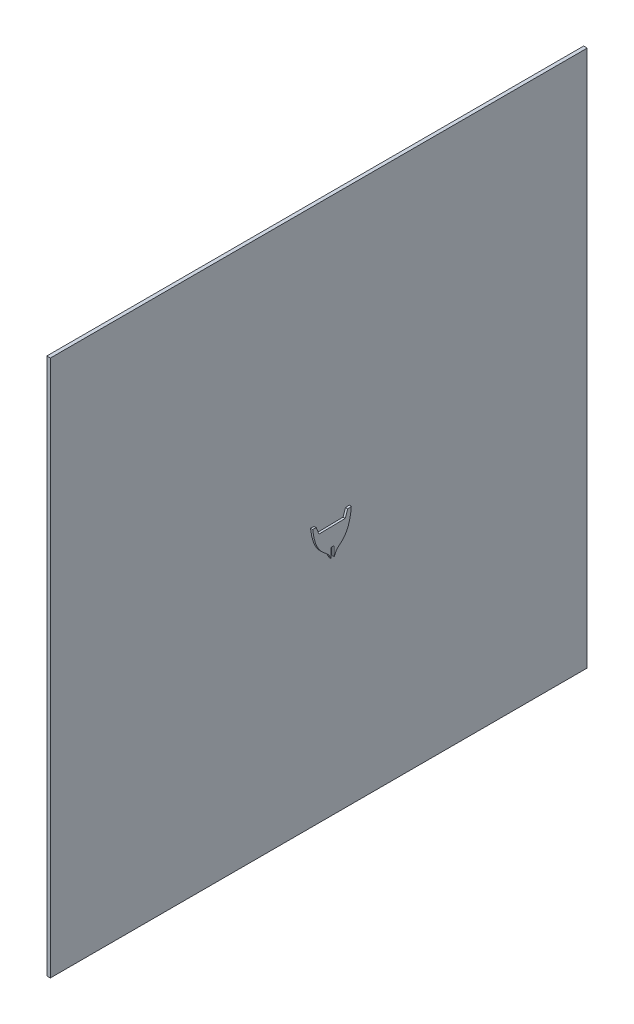
ISO-10303-21;
HEADER;
FILE_DESCRIPTION(('STEP AP214'),'2;1');
FILE_NAME('part.step','',(''),(''),'','','');
FILE_SCHEMA(('AUTOMOTIVE_DESIGN { 1 0 10303 214 1 1 1 1 }'));
ENDSEC;
DATA;
#1=APPLICATION_CONTEXT('core data for automotive mechanical design processes');
#2=APPLICATION_PROTOCOL_DEFINITION('international standard','automotive_design',2000,#1);
#3=PRODUCT_CONTEXT('',#1,'mechanical');
#4=PRODUCT('Part','Part','',(#3));
#5=PRODUCT_RELATED_PRODUCT_CATEGORY('part','',(#4));
#6=PRODUCT_DEFINITION_FORMATION('','',#4);
#7=PRODUCT_DEFINITION_CONTEXT('part definition',#1,'design');
#8=PRODUCT_DEFINITION('design','',#6,#7);
#9=PRODUCT_DEFINITION_SHAPE('','',#8);
#10=(LENGTH_UNIT() NAMED_UNIT(*) SI_UNIT(.MILLI.,.METRE.));
#11=(NAMED_UNIT(*) PLANE_ANGLE_UNIT() SI_UNIT($,.RADIAN.));
#12=(NAMED_UNIT(*) SI_UNIT($,.STERADIAN.) SOLID_ANGLE_UNIT());
#13=UNCERTAINTY_MEASURE_WITH_UNIT(LENGTH_MEASURE(1.E-05),#10,'distance_accuracy_value','');
#14=(GEOMETRIC_REPRESENTATION_CONTEXT(3) GLOBAL_UNCERTAINTY_ASSIGNED_CONTEXT((#13)) GLOBAL_UNIT_ASSIGNED_CONTEXT((#10,
#11,#12)) REPRESENTATION_CONTEXT('',''));
#15=CARTESIAN_POINT('',(0.,0.,0.));
#16=DIRECTION('',(0.,0.,1.));
#17=DIRECTION('',(1.,0.,0.));
#18=AXIS2_PLACEMENT_3D('',#15,#16,#17);
#19=CARTESIAN_POINT('',(6.,356.105695529386,60.4792665259948));
#20=CARTESIAN_POINT('',(6.,286.61749502081,52.7706352403442));
#21=CARTESIAN_POINT('',(6.,278.791819942509,24.4972285058388));
#22=CARTESIAN_POINT('',(6.,286.61749502081,15.6617889013058));
#23=CARTESIAN_POINT('',(6.,245.146035866798,4.44091292248795));
#24=B_SPLINE_CURVE_WITH_KNOTS('',4,(#19,#20,#21,#22,#23),.UNSPECIFIED.,.F.,.F.,(5,5),(0.,1.),.UNSPECIFIED.);
#25=DIRECTION('',(-1.,0.,0.));
#26=VECTOR('',#25,1.);
#27=SURFACE_OF_LINEAR_EXTRUSION('',#24,#26);
#28=CARTESIAN_POINT('',(0.,356.105695529386,60.4792665259948));
#29=CARTESIAN_POINT('',(0.,286.61749502081,52.7706352403442));
#30=CARTESIAN_POINT('',(0.,278.791819942509,24.4972285058388));
#31=CARTESIAN_POINT('',(0.,286.61749502081,15.6617889013058));
#32=CARTESIAN_POINT('',(0.,245.146035866798,4.44091292248795));
#33=B_SPLINE_CURVE_WITH_KNOTS('',4,(#28,#29,#30,#31,#32),.UNSPECIFIED.,.F.,.F.,(5,5),(0.,1.),.UNSPECIFIED.);
#34=CARTESIAN_POINT('',(0.,356.105695529386,60.4792665259948));
#35=VERTEX_POINT('',#34);
#36=CARTESIAN_POINT('',(0.,259.903423688903,9.20972532121438));
#37=VERTEX_POINT('',#36);
#38=EDGE_CURVE('E144',#35,#37,#33,.T.);
#39=ORIENTED_EDGE('',*,*,#38,.T.);
#40=DIRECTION('',(1.,0.,0.));
#41=VECTOR('',#40,1.);
#42=CARTESIAN_POINT('',(0.,259.903423688903,9.20972532121438));
#43=LINE('',#42,#41);
#44=CARTESIAN_POINT('',(6.,259.903423688903,9.20972532121438));
#45=VERTEX_POINT('',#44);
#46=EDGE_CURVE('E150',#37,#45,#43,.T.);
#47=ORIENTED_EDGE('',*,*,#46,.T.);
#48=CARTESIAN_POINT('',(6.,356.105695529386,60.4792665259948));
#49=VERTEX_POINT('',#48);
#50=EDGE_CURVE('E168',#49,#45,#24,.T.);
#51=ORIENTED_EDGE('',*,*,#50,.F.);
#52=DIRECTION('',(-1.,0.,0.));
#53=VECTOR('',#52,1.);
#54=CARTESIAN_POINT('',(6.,356.105695529386,60.4792665259948));
#55=LINE('',#54,#53);
#56=EDGE_CURVE('E140',#49,#35,#55,.T.);
#57=ORIENTED_EDGE('',*,*,#56,.T.);
#58=EDGE_LOOP('',(#39,#47,#51,#57));
#59=FACE_BOUND('',#58,.T.);
#60=ADVANCED_FACE('F46',(#59),#27,.F.);
#61=CARTESIAN_POINT('',(6.,245.146035866798,4.44091292248795));
#62=CARTESIAN_POINT('',(6.,286.996692264015,-5.27055149936918));
#63=CARTESIAN_POINT('',(6.,279.496161382421,-14.3836311067655));
#64=CARTESIAN_POINT('',(6.,288.340732696359,-42.3550500389287));
#65=CARTESIAN_POINT('',(6.,358.062538617364,-47.5418395403267));
#66=B_SPLINE_CURVE_WITH_KNOTS('',4,(#61,#62,#63,#64,#65),.UNSPECIFIED.,.F.,.F.,(5,5),(0.,1.),.UNSPECIFIED.);
#67=DIRECTION('',(-1.,0.,0.));
#68=VECTOR('',#67,1.);
#69=SURFACE_OF_LINEAR_EXTRUSION('',#66,#68);
#70=CARTESIAN_POINT('',(6.,260.066462084205,0.209725321214382));
#71=VERTEX_POINT('',#70);
#72=CARTESIAN_POINT('',(6.,358.062538617364,-47.5418395403267));
#73=VERTEX_POINT('',#72);
#74=EDGE_CURVE('E105',#71,#73,#66,.T.);
#75=ORIENTED_EDGE('',*,*,#74,.F.);
#76=DIRECTION('',(1.,0.,0.));
#77=VECTOR('',#76,1.);
#78=CARTESIAN_POINT('',(0.,260.066462084205,0.209725321214382));
#79=LINE('',#78,#77);
#80=CARTESIAN_POINT('',(0.,260.066462084205,0.209725321214382));
#81=VERTEX_POINT('',#80);
#82=EDGE_CURVE('E196',#81,#71,#79,.T.);
#83=ORIENTED_EDGE('',*,*,#82,.F.);
#84=CARTESIAN_POINT('',(0.,245.146035866798,4.44091292248795));
#85=CARTESIAN_POINT('',(0.,286.996692264015,-5.27055149936918));
#86=CARTESIAN_POINT('',(0.,279.496161382421,-14.3836311067655));
#87=CARTESIAN_POINT('',(0.,288.340732696359,-42.3550500389287));
#88=CARTESIAN_POINT('',(0.,358.062538617364,-47.5418395403267));
#89=B_SPLINE_CURVE_WITH_KNOTS('',4,(#84,#85,#86,#87,#88),.UNSPECIFIED.,.F.,.F.,(5,5),(0.,1.),.UNSPECIFIED.);
#90=CARTESIAN_POINT('',(0.,358.062538617364,-47.5418395403267));
#91=VERTEX_POINT('',#90);
#92=EDGE_CURVE('E149',#81,#91,#89,.T.);
#93=ORIENTED_EDGE('',*,*,#92,.T.);
#94=DIRECTION('',(-1.,0.,0.));
#95=VECTOR('',#94,1.);
#96=CARTESIAN_POINT('',(6.,358.062538617364,-47.5418395403267));
#97=LINE('',#96,#95);
#98=EDGE_CURVE('E13',#73,#91,#97,.T.);
#99=ORIENTED_EDGE('',*,*,#98,.F.);
#100=EDGE_LOOP('',(#75,#83,#93,#99));
#101=FACE_BOUND('',#100,.T.);
#102=ADVANCED_FACE('F208',(#101),#69,.F.);
#103=CARTESIAN_POINT('',(6.,358.062538617364,-47.5418395403267));
#104=DIRECTION('',(0.,-0.994938698469687,-0.100483761312194));
#105=DIRECTION('',(0.,0.100483761312194,-0.994938698469687));
#106=AXIS2_PLACEMENT_3D('',#103,#104,#105);
#107=PLANE('',#106);
#108=DIRECTION('',(0.,-0.100483761312194,0.994938698469687));
#109=VECTOR('',#108,1.);
#110=CARTESIAN_POINT('',(0.,358.062538617364,-47.5418395403267));
#111=LINE('',#110,#109);
#112=CARTESIAN_POINT('',(0.,357.038033491365,-37.3977149243068));
#113=VERTEX_POINT('',#112);
#114=EDGE_CURVE('E157',#91,#113,#111,.T.);
#115=ORIENTED_EDGE('',*,*,#114,.T.);
#116=DIRECTION('',(-1.,0.,0.));
#117=VECTOR('',#116,1.);
#118=CARTESIAN_POINT('',(6.,357.038033491365,-37.3977149243068));
#119=LINE('',#118,#117);
#120=CARTESIAN_POINT('',(6.,357.038033491365,-37.3977149243068));
#121=VERTEX_POINT('',#120);
#122=EDGE_CURVE('E54',#121,#113,#119,.T.);
#123=ORIENTED_EDGE('',*,*,#122,.F.);
#124=DIRECTION('',(0.,-0.100483761312194,0.994938698469687));
#125=VECTOR('',#124,1.);
#126=CARTESIAN_POINT('',(6.,358.062538617364,-47.5418395403267));
#127=LINE('',#126,#125);
#128=EDGE_CURVE('E190',#73,#121,#127,.T.);
#129=ORIENTED_EDGE('',*,*,#128,.F.);
#130=ORIENTED_EDGE('',*,*,#98,.T.);
#131=EDGE_LOOP('',(#115,#123,#129,#130));
#132=FACE_BOUND('',#131,.T.);
#133=ADVANCED_FACE('F211',(#132),#107,.F.);
#134=CARTESIAN_POINT('',(6.,357.038033491365,-37.3977149243068));
#135=DIRECTION('',(0.,-0.329497931100059,-0.944156297124995));
#136=DIRECTION('',(0.,0.944156297124995,-0.329497931100059));
#137=AXIS2_PLACEMENT_3D('',#134,#135,#136);
#138=PLANE('',#137);
#139=DIRECTION('',(0.,-0.944156297124995,0.329497931100058));
#140=VECTOR('',#139,1.);
#141=CARTESIAN_POINT('',(0.,357.038033491365,-37.3977149243068));
#142=LINE('',#141,#140);
#143=CARTESIAN_POINT('',(0.,337.397786243656,-30.5435310840679));
#144=VERTEX_POINT('',#143);
#145=EDGE_CURVE('E162',#113,#144,#142,.T.);
#146=ORIENTED_EDGE('',*,*,#145,.T.);
#147=DIRECTION('',(-1.,0.,0.));
#148=VECTOR('',#147,1.);
#149=CARTESIAN_POINT('',(6.,337.397786243656,-30.5435310840679));
#150=LINE('',#149,#148);
#151=CARTESIAN_POINT('',(6.,337.397786243656,-30.5435310840679));
#152=VERTEX_POINT('',#151);
#153=EDGE_CURVE('E135',#152,#144,#150,.T.);
#154=ORIENTED_EDGE('',*,*,#153,.F.);
#155=DIRECTION('',(0.,-0.944156297124995,0.329497931100058));
#156=VECTOR('',#155,1.);
#157=CARTESIAN_POINT('',(6.,357.038033491365,-37.3977149243068));
#158=LINE('',#157,#156);
#159=EDGE_CURVE('E123',#121,#152,#158,.T.);
#160=ORIENTED_EDGE('',*,*,#159,.F.);
#161=ORIENTED_EDGE('',*,*,#122,.T.);
#162=EDGE_LOOP('',(#146,#154,#160,#161));
#163=FACE_BOUND('',#162,.T.);
#164=ADVANCED_FACE('F175',(#163),#138,.F.);
#165=CARTESIAN_POINT('',(6.,336.070161183109,42.7436570213848));
#166=DIRECTION('',(0.,-0.999835956927465,-0.0181124055536429));
#167=DIRECTION('',(0.,0.0181124055536429,-0.999835956927466));
#168=AXIS2_PLACEMENT_3D('',#165,#166,#167);
#169=PLANE('',#168);
#170=DIRECTION('',(0.,-0.0181124055536429,0.999835956927465));
#171=VECTOR('',#170,1.);
#172=CARTESIAN_POINT('',(0.,336.070161183109,42.7436570213848));
#173=LINE('',#172,#171);
#174=CARTESIAN_POINT('',(0.,336.070161183109,42.7436570213848));
#175=VERTEX_POINT('',#174);
#176=EDGE_CURVE('E132',#144,#175,#173,.T.);
#177=ORIENTED_EDGE('',*,*,#176,.T.);
#178=DIRECTION('',(-1.,0.,0.));
#179=VECTOR('',#178,1.);
#180=CARTESIAN_POINT('',(6.,336.070161183109,42.7436570213848));
#181=LINE('',#180,#179);
#182=CARTESIAN_POINT('',(6.,336.070161183109,42.7436570213848));
#183=VERTEX_POINT('',#182);
#184=EDGE_CURVE('E129',#183,#175,#181,.T.);
#185=ORIENTED_EDGE('',*,*,#184,.F.);
#186=DIRECTION('',(0.,-0.0181124055536429,0.999835956927465));
#187=VECTOR('',#186,1.);
#188=CARTESIAN_POINT('',(6.,336.070161183109,42.7436570213848));
#189=LINE('',#188,#187);
#190=EDGE_CURVE('E116',#152,#183,#189,.T.);
#191=ORIENTED_EDGE('',*,*,#190,.F.);
#192=ORIENTED_EDGE('',*,*,#153,.T.);
#193=EDGE_LOOP('',(#177,#185,#191,#192));
#194=FACE_BOUND('',#193,.T.);
#195=ADVANCED_FACE('F130',(#194),#169,.F.);
#196=CARTESIAN_POINT('',(6.,355.449271317442,50.3046912408778));
#197=DIRECTION('',(0.,-0.363478014358725,0.931602776443822));
#198=DIRECTION('',(0.,-0.931602776443822,-0.363478014358725));
#199=AXIS2_PLACEMENT_3D('',#196,#197,#198);
#200=PLANE('',#199);
#201=DIRECTION('',(0.,0.931602776443822,0.363478014358725));
#202=VECTOR('',#201,1.);
#203=CARTESIAN_POINT('',(0.,355.449271317442,50.3046912408778));
#204=LINE('',#203,#202);
#205=CARTESIAN_POINT('',(0.,355.449271317442,50.3046912408778));
#206=VERTEX_POINT('',#205);
#207=EDGE_CURVE('E165',#175,#206,#204,.T.);
#208=ORIENTED_EDGE('',*,*,#207,.T.);
#209=DIRECTION('',(-1.,0.,0.));
#210=VECTOR('',#209,1.);
#211=CARTESIAN_POINT('',(6.,355.449271317442,50.3046912408778));
#212=LINE('',#211,#210);
#213=CARTESIAN_POINT('',(6.,355.449271317442,50.3046912408778));
#214=VERTEX_POINT('',#213);
#215=EDGE_CURVE('E136',#214,#206,#212,.T.);
#216=ORIENTED_EDGE('',*,*,#215,.F.);
#217=DIRECTION('',(0.,0.931602776443822,0.363478014358725));
#218=VECTOR('',#217,1.);
#219=CARTESIAN_POINT('',(6.,355.449271317442,50.3046912408778));
#220=LINE('',#219,#218);
#221=EDGE_CURVE('E120',#183,#214,#220,.T.);
#222=ORIENTED_EDGE('',*,*,#221,.F.);
#223=ORIENTED_EDGE('',*,*,#184,.T.);
#224=EDGE_LOOP('',(#208,#216,#222,#223));
#225=FACE_BOUND('',#224,.T.);
#226=ADVANCED_FACE('F138',(#225),#200,.F.);
#227=CARTESIAN_POINT('',(6.,356.105695529386,60.4792665259948));
#228=DIRECTION('',(0.,-0.997925308968458,0.064382277997968));
#229=DIRECTION('',(0.,-0.064382277997968,-0.997925308968458));
#230=AXIS2_PLACEMENT_3D('',#227,#228,#229);
#231=PLANE('',#230);
#232=DIRECTION('',(0.,0.064382277997968,0.997925308968458));
#233=VECTOR('',#232,1.);
#234=CARTESIAN_POINT('',(0.,356.105695529386,60.4792665259948));
#235=LINE('',#234,#233);
#236=EDGE_CURVE('E97',#206,#35,#235,.T.);
#237=ORIENTED_EDGE('',*,*,#236,.T.);
#238=ORIENTED_EDGE('',*,*,#56,.F.);
#239=DIRECTION('',(0.,0.064382277997968,0.997925308968458));
#240=VECTOR('',#239,1.);
#241=CARTESIAN_POINT('',(6.,356.105695529386,60.4792665259948));
#242=LINE('',#241,#240);
#243=EDGE_CURVE('E70',#214,#49,#242,.T.);
#244=ORIENTED_EDGE('',*,*,#243,.F.);
#245=ORIENTED_EDGE('',*,*,#215,.T.);
#246=EDGE_LOOP('',(#237,#238,#244,#245));
#247=FACE_BOUND('',#246,.T.);
#248=ADVANCED_FACE('F184',(#247),#231,.F.);
#249=CARTESIAN_POINT('',(6.,285.433913201107,30.3520779406322));
#250=DIRECTION('',(-1.,0.,0.));
#251=DIRECTION('',(0.,0.,1.));
#252=AXIS2_PLACEMENT_3D('',#249,#250,#251);
#253=PLANE('',#252);
#254=ORIENTED_EDGE('',*,*,#50,.T.);
#255=DIRECTION('',(0.,-0.999835956927465,-0.0181124055536429));
#256=VECTOR('',#255,1.);
#257=CARTESIAN_POINT('',(6.,259.903423688903,9.20972532121438));
#258=LINE('',#257,#256);
#259=CARTESIAN_POINT('',(6.,286.903423688903,9.69884050712066));
#260=VERTEX_POINT('',#259);
#261=EDGE_CURVE('E312',#260,#45,#258,.T.);
#262=ORIENTED_EDGE('',*,*,#261,.F.);
#263=DIRECTION('',(0.,-0.0181124055536469,0.999835956927465));
#264=VECTOR('',#263,1.);
#265=CARTESIAN_POINT('',(6.,286.903423688903,9.69884050712066));
#266=LINE('',#265,#264);
#267=CARTESIAN_POINT('',(6.,287.066462084205,0.698840507120659));
#268=VERTEX_POINT('',#267);
#269=EDGE_CURVE('E320',#268,#260,#266,.T.);
#270=ORIENTED_EDGE('',*,*,#269,.F.);
#271=DIRECTION('',(0.,0.999835956927465,0.0181124055536429));
#272=VECTOR('',#271,1.);
#273=CARTESIAN_POINT('',(6.,287.066462084205,0.698840507120659));
#274=LINE('',#273,#272);
#275=EDGE_CURVE('E324',#71,#268,#274,.T.);
#276=ORIENTED_EDGE('',*,*,#275,.F.);
#277=ORIENTED_EDGE('',*,*,#74,.T.);
#278=ORIENTED_EDGE('',*,*,#128,.T.);
#279=ORIENTED_EDGE('',*,*,#159,.T.);
#280=ORIENTED_EDGE('',*,*,#190,.T.);
#281=ORIENTED_EDGE('',*,*,#221,.T.);
#282=ORIENTED_EDGE('',*,*,#243,.T.);
#283=EDGE_LOOP('',(#254,#262,#270,#276,#277,#278,#279,#280,#281,#282));
#284=FACE_BOUND('',#283,.T.);
#285=ADVANCED_FACE('F118',(#284),#253,.F.);
#286=CARTESIAN_POINT('',(0.,285.433913201107,30.3520779406322));
#287=DIRECTION('',(-1.,0.,0.));
#288=DIRECTION('',(0.,0.,1.));
#289=AXIS2_PLACEMENT_3D('',#286,#287,#288);
#290=PLANE('',#289);
#291=DIRECTION('',(0.,-0.999835956927465,-0.0181124055536429));
#292=VECTOR('',#291,1.);
#293=CARTESIAN_POINT('',(0.,259.903423688903,9.20972532121438));
#294=LINE('',#293,#292);
#295=CARTESIAN_POINT('',(0.,286.903423688903,9.69884050712066));
#296=VERTEX_POINT('',#295);
#297=EDGE_CURVE('E333',#296,#37,#294,.T.);
#298=ORIENTED_EDGE('',*,*,#297,.T.);
#299=ORIENTED_EDGE('',*,*,#38,.F.);
#300=ORIENTED_EDGE('',*,*,#236,.F.);
#301=ORIENTED_EDGE('',*,*,#207,.F.);
#302=ORIENTED_EDGE('',*,*,#176,.F.);
#303=ORIENTED_EDGE('',*,*,#145,.F.);
#304=ORIENTED_EDGE('',*,*,#114,.F.);
#305=ORIENTED_EDGE('',*,*,#92,.F.);
#306=DIRECTION('',(0.,0.999835956927465,0.0181124055536429));
#307=VECTOR('',#306,1.);
#308=CARTESIAN_POINT('',(0.,287.066462084205,0.698840507120659));
#309=LINE('',#308,#307);
#310=CARTESIAN_POINT('',(0.,287.066462084205,0.698840507120666));
#311=VERTEX_POINT('',#310);
#312=EDGE_CURVE('E319',#81,#311,#309,.T.);
#313=ORIENTED_EDGE('',*,*,#312,.T.);
#314=DIRECTION('',(0.,-0.0181124055536469,0.999835956927465));
#315=VECTOR('',#314,1.);
#316=CARTESIAN_POINT('',(0.,286.903423688903,9.69884050712066));
#317=LINE('',#316,#315);
#318=EDGE_CURVE('E61',#311,#296,#317,.T.);
#319=ORIENTED_EDGE('',*,*,#318,.T.);
#320=EDGE_LOOP('',(#298,#299,#300,#301,#302,#303,#304,#305,#313,#319));
#321=FACE_BOUND('',#320,.T.);
#322=ADVANCED_FACE('F181',(#321),#290,.T.);
#323=CARTESIAN_POINT('',(0.,259.903423688903,9.20972532121438));
#324=DIRECTION('',(0.,-0.0181124055536429,0.999835956927465));
#325=DIRECTION('',(0.,-0.999835956927466,-0.0181124055536429));
#326=AXIS2_PLACEMENT_3D('',#323,#324,#325);
#327=PLANE('',#326);
#328=ORIENTED_EDGE('',*,*,#261,.T.);
#329=ORIENTED_EDGE('',*,*,#46,.F.);
#330=ORIENTED_EDGE('',*,*,#297,.F.);
#331=DIRECTION('',(1.,0.,0.));
#332=VECTOR('',#331,1.);
#333=CARTESIAN_POINT('',(0.,286.903423688903,9.69884050712066));
#334=LINE('',#333,#332);
#335=EDGE_CURVE('E315',#296,#260,#334,.T.);
#336=ORIENTED_EDGE('',*,*,#335,.T.);
#337=EDGE_LOOP('',(#328,#329,#330,#336));
#338=FACE_BOUND('',#337,.T.);
#339=ADVANCED_FACE('F225',(#338),#327,.F.);
#340=CARTESIAN_POINT('',(0.,286.903423688903,9.69884050712066));
#341=DIRECTION('',(0.,0.999835956927465,0.0181124055536469));
#342=DIRECTION('',(0.,-0.0181124055536469,0.999835956927465));
#343=AXIS2_PLACEMENT_3D('',#340,#341,#342);
#344=PLANE('',#343);
#345=ORIENTED_EDGE('',*,*,#269,.T.);
#346=ORIENTED_EDGE('',*,*,#335,.F.);
#347=ORIENTED_EDGE('',*,*,#318,.F.);
#348=DIRECTION('',(1.,0.,0.));
#349=VECTOR('',#348,1.);
#350=CARTESIAN_POINT('',(0.,287.066462084205,0.698840507120659));
#351=LINE('',#350,#349);
#352=EDGE_CURVE('E329',#311,#268,#351,.T.);
#353=ORIENTED_EDGE('',*,*,#352,.T.);
#354=EDGE_LOOP('',(#345,#346,#347,#353));
#355=FACE_BOUND('',#354,.T.);
#356=ADVANCED_FACE('F231',(#355),#344,.F.);
#357=CARTESIAN_POINT('',(0.,287.066462084205,0.698840507120659));
#358=DIRECTION('',(0.,0.0181124055536428,-0.999835956927465));
#359=DIRECTION('',(0.,0.999835956927466,0.0181124055536429));
#360=AXIS2_PLACEMENT_3D('',#357,#358,#359);
#361=PLANE('',#360);
#362=ORIENTED_EDGE('',*,*,#275,.T.);
#363=ORIENTED_EDGE('',*,*,#352,.F.);
#364=ORIENTED_EDGE('',*,*,#312,.F.);
#365=ORIENTED_EDGE('',*,*,#82,.T.);
#366=EDGE_LOOP('',(#362,#363,#364,#365));
#367=FACE_BOUND('',#366,.T.);
#368=ADVANCED_FACE('F228',(#367),#361,.F.);
#369=CLOSED_SHELL('',(#60,#102,#133,#164,#195,#226,#248,#285,#322,#339,#356,#368));
#370=MANIFOLD_SOLID_BREP('B2',#369);
#371=CARTESIAN_POINT('',(-10.,0.,0.));
#372=DIRECTION('',(-1.,0.,0.));
#373=DIRECTION('',(0.,0.,1.));
#374=AXIS2_PLACEMENT_3D('',#371,#372,#373);
#375=PLANE('',#374);
#376=DIRECTION('',(0.,0.,-1.));
#377=VECTOR('',#376,1.);
#378=CARTESIAN_POINT('',(-10.,-378.710653275796,777.274991403029));
#379=LINE('',#378,#377);
#380=CARTESIAN_POINT('',(-10.,-378.710653275796,777.274991403029));
#381=VERTEX_POINT('',#380);
#382=CARTESIAN_POINT('',(-10.,-378.710653275796,-722.725008596971));
#383=VERTEX_POINT('',#382);
#384=EDGE_CURVE('E357',#381,#383,#379,.T.);
#385=ORIENTED_EDGE('',*,*,#384,.T.);
#386=DIRECTION('',(0.,-1.,0.));
#387=VECTOR('',#386,1.);
#388=CARTESIAN_POINT('',(-10.,1121.2893467242,-722.725008596971));
#389=LINE('',#388,#387);
#390=CARTESIAN_POINT('',(-10.,1121.2893467242,-722.725008596971));
#391=VERTEX_POINT('',#390);
#392=EDGE_CURVE('E391',#391,#383,#389,.T.);
#393=ORIENTED_EDGE('',*,*,#392,.F.);
#394=DIRECTION('',(0.,0.,-1.));
#395=VECTOR('',#394,1.);
#396=CARTESIAN_POINT('',(-10.,1121.2893467242,777.274991403029));
#397=LINE('',#396,#395);
#398=CARTESIAN_POINT('',(-10.,1121.2893467242,777.274991403029));
#399=VERTEX_POINT('',#398);
#400=EDGE_CURVE('E388',#399,#391,#397,.T.);
#401=ORIENTED_EDGE('',*,*,#400,.F.);
#402=DIRECTION('',(0.,-1.,0.));
#403=VECTOR('',#402,1.);
#404=CARTESIAN_POINT('',(-10.,1121.2893467242,777.274991403029));
#405=LINE('',#404,#403);
#406=EDGE_CURVE('E385',#399,#381,#405,.T.);
#407=ORIENTED_EDGE('',*,*,#406,.T.);
#408=EDGE_LOOP('',(#385,#393,#401,#407));
#409=FACE_BOUND('',#408,.T.);
#410=ADVANCED_FACE('F348',(#409),#375,.F.);
#411=CARTESIAN_POINT('',(-20.,0.,0.));
#412=DIRECTION('',(-1.,0.,0.));
#413=DIRECTION('',(0.,0.,1.));
#414=AXIS2_PLACEMENT_3D('',#411,#412,#413);
#415=PLANE('',#414);
#416=DIRECTION('',(0.,0.,-1.));
#417=VECTOR('',#416,1.);
#418=CARTESIAN_POINT('',(-20.,-378.710653275796,777.274991403029));
#419=LINE('',#418,#417);
#420=CARTESIAN_POINT('',(-20.,-378.710653275796,777.274991403029));
#421=VERTEX_POINT('',#420);
#422=CARTESIAN_POINT('',(-20.,-378.710653275796,-722.725008596971));
#423=VERTEX_POINT('',#422);
#424=EDGE_CURVE('E44',#421,#423,#419,.T.);
#425=ORIENTED_EDGE('',*,*,#424,.F.);
#426=DIRECTION('',(0.,-1.,0.));
#427=VECTOR('',#426,1.);
#428=CARTESIAN_POINT('',(-20.,1121.2893467242,777.274991403029));
#429=LINE('',#428,#427);
#430=CARTESIAN_POINT('',(-20.,1121.2893467242,777.274991403029));
#431=VERTEX_POINT('',#430);
#432=EDGE_CURVE('E404',#431,#421,#429,.T.);
#433=ORIENTED_EDGE('',*,*,#432,.F.);
#434=DIRECTION('',(0.,0.,-1.));
#435=VECTOR('',#434,1.);
#436=CARTESIAN_POINT('',(-20.,1121.2893467242,777.274991403029));
#437=LINE('',#436,#435);
#438=CARTESIAN_POINT('',(-20.,1121.2893467242,-722.725008596971));
#439=VERTEX_POINT('',#438);
#440=EDGE_CURVE('E395',#431,#439,#437,.T.);
#441=ORIENTED_EDGE('',*,*,#440,.T.);
#442=DIRECTION('',(0.,-1.,0.));
#443=VECTOR('',#442,1.);
#444=CARTESIAN_POINT('',(-20.,1121.2893467242,-722.725008596971));
#445=LINE('',#444,#443);
#446=EDGE_CURVE('E366',#439,#423,#445,.T.);
#447=ORIENTED_EDGE('',*,*,#446,.T.);
#448=EDGE_LOOP('',(#425,#433,#441,#447));
#449=FACE_BOUND('',#448,.T.);
#450=ADVANCED_FACE('F444',(#449),#415,.T.);
#451=CARTESIAN_POINT('',(-20.,1121.2893467242,777.274991403029));
#452=DIRECTION('',(0.,0.,1.));
#453=DIRECTION('',(1.,0.,0.));
#454=AXIS2_PLACEMENT_3D('',#451,#452,#453);
#455=PLANE('',#454);
#456=ORIENTED_EDGE('',*,*,#406,.F.);
#457=DIRECTION('',(1.,0.,0.));
#458=VECTOR('',#457,1.);
#459=CARTESIAN_POINT('',(-20.,1121.2893467242,777.274991403029));
#460=LINE('',#459,#458);
#461=EDGE_CURVE('E400',#431,#399,#460,.T.);
#462=ORIENTED_EDGE('',*,*,#461,.F.);
#463=ORIENTED_EDGE('',*,*,#432,.T.);
#464=DIRECTION('',(1.,0.,0.));
#465=VECTOR('',#464,1.);
#466=CARTESIAN_POINT('',(-20.,-378.710653275796,777.274991403029));
#467=LINE('',#466,#465);
#468=EDGE_CURVE('E396',#421,#381,#467,.T.);
#469=ORIENTED_EDGE('',*,*,#468,.T.);
#470=EDGE_LOOP('',(#456,#462,#463,#469));
#471=FACE_BOUND('',#470,.T.);
#472=ADVANCED_FACE('F405',(#471),#455,.T.);
#473=CARTESIAN_POINT('',(-20.,-378.710653275796,777.274991403029));
#474=DIRECTION('',(0.,-1.,0.));
#475=DIRECTION('',(0.,0.,-1.));
#476=AXIS2_PLACEMENT_3D('',#473,#474,#475);
#477=PLANE('',#476);
#478=ORIENTED_EDGE('',*,*,#384,.F.);
#479=ORIENTED_EDGE('',*,*,#468,.F.);
#480=ORIENTED_EDGE('',*,*,#424,.T.);
#481=DIRECTION('',(1.,0.,0.));
#482=VECTOR('',#481,1.);
#483=CARTESIAN_POINT('',(-20.,-378.710653275796,-722.725008596971));
#484=LINE('',#483,#482);
#485=EDGE_CURVE('E416',#423,#383,#484,.T.);
#486=ORIENTED_EDGE('',*,*,#485,.T.);
#487=EDGE_LOOP('',(#478,#479,#480,#486));
#488=FACE_BOUND('',#487,.T.);
#489=ADVANCED_FACE('F446',(#488),#477,.T.);
#490=CARTESIAN_POINT('',(-20.,1121.2893467242,777.274991403029));
#491=DIRECTION('',(0.,-1.,0.));
#492=DIRECTION('',(0.,0.,-1.));
#493=AXIS2_PLACEMENT_3D('',#490,#491,#492);
#494=PLANE('',#493);
#495=ORIENTED_EDGE('',*,*,#400,.T.);
#496=DIRECTION('',(1.,0.,0.));
#497=VECTOR('',#496,1.);
#498=CARTESIAN_POINT('',(-20.,1121.2893467242,-722.725008596971));
#499=LINE('',#498,#497);
#500=EDGE_CURVE('E420',#439,#391,#499,.T.);
#501=ORIENTED_EDGE('',*,*,#500,.F.);
#502=ORIENTED_EDGE('',*,*,#440,.F.);
#503=ORIENTED_EDGE('',*,*,#461,.T.);
#504=EDGE_LOOP('',(#495,#501,#502,#503));
#505=FACE_BOUND('',#504,.T.);
#506=ADVANCED_FACE('F401',(#505),#494,.F.);
#507=CARTESIAN_POINT('',(-20.,1121.2893467242,-722.725008596971));
#508=DIRECTION('',(0.,0.,1.));
#509=DIRECTION('',(1.,0.,0.));
#510=AXIS2_PLACEMENT_3D('',#507,#508,#509);
#511=PLANE('',#510);
#512=ORIENTED_EDGE('',*,*,#392,.T.);
#513=ORIENTED_EDGE('',*,*,#485,.F.);
#514=ORIENTED_EDGE('',*,*,#446,.F.);
#515=ORIENTED_EDGE('',*,*,#500,.T.);
#516=EDGE_LOOP('',(#512,#513,#514,#515));
#517=FACE_BOUND('',#516,.T.);
#518=ADVANCED_FACE('F431',(#517),#511,.F.);
#519=CLOSED_SHELL('',(#410,#450,#472,#489,#506,#518));
#520=MANIFOLD_SOLID_BREP('B7_NOT_SHOWN',#519);
#521=ADVANCED_BREP_SHAPE_REPRESENTATION('',(#18,#370,#520),#14);
#522=SHAPE_DEFINITION_REPRESENTATION(#9,#521);
ENDSEC;
END-ISO-10303-21;
